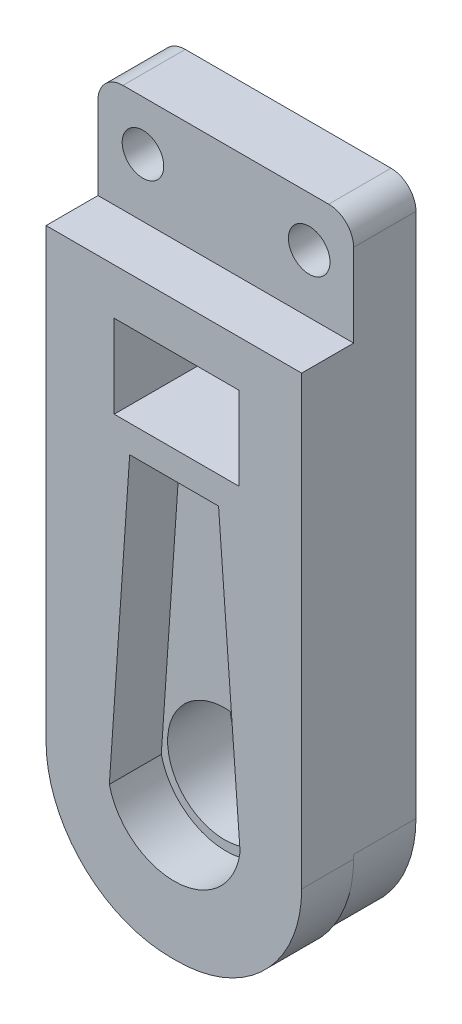
ISO-10303-21;
HEADER;
FILE_DESCRIPTION(('STEP AP214'),'2;1');
FILE_NAME('part.step','',(''),(''),'','','');
FILE_SCHEMA(('AUTOMOTIVE_DESIGN { 1 0 10303 214 1 1 1 1 }'));
ENDSEC;
DATA;
#1=APPLICATION_CONTEXT('core data for automotive mechanical design processes');
#2=APPLICATION_PROTOCOL_DEFINITION('international standard','automotive_design',2000,#1);
#3=PRODUCT_CONTEXT('',#1,'mechanical');
#4=PRODUCT('Part','Part','',(#3));
#5=PRODUCT_RELATED_PRODUCT_CATEGORY('part','',(#4));
#6=PRODUCT_DEFINITION_FORMATION('','',#4);
#7=PRODUCT_DEFINITION_CONTEXT('part definition',#1,'design');
#8=PRODUCT_DEFINITION('design','',#6,#7);
#9=PRODUCT_DEFINITION_SHAPE('','',#8);
#10=(LENGTH_UNIT() NAMED_UNIT(*) SI_UNIT(.MILLI.,.METRE.));
#11=(NAMED_UNIT(*) PLANE_ANGLE_UNIT() SI_UNIT($,.RADIAN.));
#12=(NAMED_UNIT(*) SI_UNIT($,.STERADIAN.) SOLID_ANGLE_UNIT());
#13=UNCERTAINTY_MEASURE_WITH_UNIT(LENGTH_MEASURE(1.E-05),#10,'distance_accuracy_value','');
#14=(GEOMETRIC_REPRESENTATION_CONTEXT(3) GLOBAL_UNCERTAINTY_ASSIGNED_CONTEXT((#13)) GLOBAL_UNIT_ASSIGNED_CONTEXT((#10,
#11,#12)) REPRESENTATION_CONTEXT('',''));
#15=CARTESIAN_POINT('',(0.,0.,0.));
#16=DIRECTION('',(0.,0.,1.));
#17=DIRECTION('',(1.,0.,0.));
#18=AXIS2_PLACEMENT_3D('',#15,#16,#17);
#19=CARTESIAN_POINT('',(0.,0.,13.));
#20=DIRECTION('',(0.,0.,1.));
#21=DIRECTION('',(1.,0.,0.));
#22=AXIS2_PLACEMENT_3D('',#19,#20,#21);
#23=PLANE('',#22);
#24=DIRECTION('',(-1.,0.,0.));
#25=VECTOR('',#24,1.);
#26=CARTESIAN_POINT('',(-188.162491079749,121.02562941971,13.));
#27=LINE('',#26,#25);
#28=CARTESIAN_POINT('',(-175.862491079749,121.02562941971,13.));
#29=VERTEX_POINT('',#28);
#30=CARTESIAN_POINT('',(-188.162491079749,121.02562941971,13.));
#31=VERTEX_POINT('',#30);
#32=EDGE_CURVE('E263',#29,#31,#27,.T.);
#33=ORIENTED_EDGE('',*,*,#32,.F.);
#34=DIRECTION('',(0.,1.,0.));
#35=VECTOR('',#34,1.);
#36=CARTESIAN_POINT('',(-175.862491079749,126.215842892689,13.));
#37=LINE('',#36,#35);
#38=CARTESIAN_POINT('',(-175.862491079749,125.015842892689,13.));
#39=VERTEX_POINT('',#38);
#40=EDGE_CURVE('E304',#29,#39,#37,.T.);
#41=ORIENTED_EDGE('',*,*,#40,.T.);
#42=CARTESIAN_POINT('',(-177.062491079749,125.015842892689,13.));
#43=DIRECTION('',(0.,0.,1.));
#44=DIRECTION('',(1.,0.,0.));
#45=AXIS2_PLACEMENT_3D('',#42,#43,#44);
#46=CIRCLE('',#45,1.2);
#47=CARTESIAN_POINT('',(-177.062491079749,126.215842892689,13.));
#48=VERTEX_POINT('',#47);
#49=EDGE_CURVE('E333',#39,#48,#46,.T.);
#50=ORIENTED_EDGE('',*,*,#49,.T.);
#51=DIRECTION('',(-1.,0.,0.));
#52=VECTOR('',#51,1.);
#53=CARTESIAN_POINT('',(-188.162491079749,126.215842892689,13.));
#54=LINE('',#53,#52);
#55=CARTESIAN_POINT('',(-186.962491079749,126.215842892689,13.));
#56=VERTEX_POINT('',#55);
#57=EDGE_CURVE('E306',#48,#56,#54,.T.);
#58=ORIENTED_EDGE('',*,*,#57,.T.);
#59=CARTESIAN_POINT('',(-186.962491079749,125.015842892689,13.));
#60=DIRECTION('',(0.,0.,1.));
#61=DIRECTION('',(1.,0.,0.));
#62=AXIS2_PLACEMENT_3D('',#59,#60,#61);
#63=CIRCLE('',#62,1.2);
#64=CARTESIAN_POINT('',(-188.162491079749,125.015842892689,13.));
#65=VERTEX_POINT('',#64);
#66=EDGE_CURVE('E331',#56,#65,#63,.T.);
#67=ORIENTED_EDGE('',*,*,#66,.T.);
#68=DIRECTION('',(0.,-1.,0.));
#69=VECTOR('',#68,1.);
#70=CARTESIAN_POINT('',(-188.162491079749,126.215842892689,13.));
#71=LINE('',#70,#69);
#72=EDGE_CURVE('E298',#65,#31,#71,.T.);
#73=ORIENTED_EDGE('',*,*,#72,.T.);
#74=EDGE_LOOP('',(#33,#41,#50,#58,#67,#73));
#75=FACE_BOUND('',#74,.T.);
#76=CARTESIAN_POINT('',(-185.999386631408,123.827694147511,13.));
#77=DIRECTION('',(0.,0.,1.));
#78=DIRECTION('',(1.,0.,0.));
#79=AXIS2_PLACEMENT_3D('',#76,#77,#78);
#80=CIRCLE('',#79,0.999999999999998);
#81=CARTESIAN_POINT('',(-184.999386631408,123.827694147511,13.));
#82=VERTEX_POINT('',#81);
#83=EDGE_CURVE('E292',#82,#82,#80,.T.);
#84=ORIENTED_EDGE('',*,*,#83,.F.);
#85=EDGE_LOOP('',(#84));
#86=FACE_BOUND('',#85,.T.);
#87=CARTESIAN_POINT('',(-177.999386631408,123.827694147511,13.));
#88=DIRECTION('',(0.,0.,1.));
#89=DIRECTION('',(1.,0.,0.));
#90=AXIS2_PLACEMENT_3D('',#87,#88,#89);
#91=CIRCLE('',#90,0.999999999999998);
#92=CARTESIAN_POINT('',(-176.999386631408,123.827694147511,13.));
#93=VERTEX_POINT('',#92);
#94=EDGE_CURVE('E286',#93,#93,#91,.T.);
#95=ORIENTED_EDGE('',*,*,#94,.F.);
#96=EDGE_LOOP('',(#95));
#97=FACE_BOUND('',#96,.T.);
#98=ADVANCED_FACE('F37',(#75,#86,#97),#23,.T.);
#99=CARTESIAN_POINT('',(0.,0.,10.));
#100=DIRECTION('',(0.,0.,1.));
#101=DIRECTION('',(1.,0.,0.));
#102=AXIS2_PLACEMENT_3D('',#99,#100,#101);
#103=PLANE('',#102);
#104=CARTESIAN_POINT('',(-182.062491079749,99.9726598983083,10.));
#105=DIRECTION('',(0.,0.,1.));
#106=DIRECTION('',(1.,0.,0.));
#107=AXIS2_PLACEMENT_3D('',#104,#105,#106);
#108=CIRCLE('',#107,2.75000000000001);
#109=CARTESIAN_POINT('',(-179.312491079749,99.9726598983083,10.));
#110=VERTEX_POINT('',#109);
#111=EDGE_CURVE('E219',#110,#110,#108,.T.);
#112=ORIENTED_EDGE('',*,*,#111,.T.);
#113=EDGE_LOOP('',(#112));
#114=FACE_BOUND('',#113,.T.);
#115=DIRECTION('',(-1.,0.,0.));
#116=VECTOR('',#115,1.);
#117=CARTESIAN_POINT('',(-184.883489059912,118.80293228032,10.));
#118=LINE('',#117,#116);
#119=CARTESIAN_POINT('',(-178.883489059912,118.80293228032,10.));
#120=VERTEX_POINT('',#119);
#121=CARTESIAN_POINT('',(-184.883489059912,118.80293228032,10.));
#122=VERTEX_POINT('',#121);
#123=EDGE_CURVE('E237',#120,#122,#118,.T.);
#124=ORIENTED_EDGE('',*,*,#123,.T.);
#125=DIRECTION('',(0.,-1.,0.));
#126=VECTOR('',#125,1.);
#127=CARTESIAN_POINT('',(-184.883489059912,118.80293228032,10.));
#128=LINE('',#127,#126);
#129=CARTESIAN_POINT('',(-184.883489059912,114.80293228032,10.));
#130=VERTEX_POINT('',#129);
#131=EDGE_CURVE('E229',#122,#130,#128,.T.);
#132=ORIENTED_EDGE('',*,*,#131,.T.);
#133=DIRECTION('',(1.,0.,0.));
#134=VECTOR('',#133,1.);
#135=CARTESIAN_POINT('',(-184.883489059912,114.80293228032,10.));
#136=LINE('',#135,#134);
#137=CARTESIAN_POINT('',(-178.883489059912,114.80293228032,10.));
#138=VERTEX_POINT('',#137);
#139=EDGE_CURVE('E232',#130,#138,#136,.T.);
#140=ORIENTED_EDGE('',*,*,#139,.T.);
#141=DIRECTION('',(0.,1.,0.));
#142=VECTOR('',#141,1.);
#143=CARTESIAN_POINT('',(-178.883489059912,118.80293228032,10.));
#144=LINE('',#143,#142);
#145=EDGE_CURVE('E60',#138,#120,#144,.T.);
#146=ORIENTED_EDGE('',*,*,#145,.T.);
#147=EDGE_LOOP('',(#124,#132,#140,#146));
#148=FACE_BOUND('',#147,.T.);
#149=DIRECTION('',(1.,0.,0.));
#150=VECTOR('',#149,1.);
#151=CARTESIAN_POINT('',(-188.162491079749,93.7158428926887,10.));
#152=LINE('',#151,#150);
#153=CARTESIAN_POINT('',(-182.162491079749,93.7158428926887,10.));
#154=VERTEX_POINT('',#153);
#155=CARTESIAN_POINT('',(-181.862491079749,93.7158428926887,10.));
#156=VERTEX_POINT('',#155);
#157=EDGE_CURVE('E312',#154,#156,#152,.T.);
#158=ORIENTED_EDGE('',*,*,#157,.F.);
#159=CARTESIAN_POINT('',(-182.162491079749,99.7158428926887,10.));
#160=DIRECTION('',(0.,0.,1.));
#161=DIRECTION('',(1.,0.,0.));
#162=AXIS2_PLACEMENT_3D('',#159,#160,#161);
#163=CIRCLE('',#162,6.);
#164=CARTESIAN_POINT('',(-188.162491079749,99.7158428926887,10.));
#165=VERTEX_POINT('',#164);
#166=EDGE_CURVE('E345',#154,#165,#163,.F.);
#167=ORIENTED_EDGE('',*,*,#166,.T.);
#168=DIRECTION('',(0.,-1.,0.));
#169=VECTOR('',#168,1.);
#170=CARTESIAN_POINT('',(-188.162491079749,126.215842892689,10.));
#171=LINE('',#170,#169);
#172=CARTESIAN_POINT('',(-188.162491079749,125.015842892689,10.));
#173=VERTEX_POINT('',#172);
#174=EDGE_CURVE('E295',#173,#165,#171,.T.);
#175=ORIENTED_EDGE('',*,*,#174,.F.);
#176=CARTESIAN_POINT('',(-186.962491079749,125.015842892689,10.));
#177=DIRECTION('',(0.,0.,1.));
#178=DIRECTION('',(1.,0.,0.));
#179=AXIS2_PLACEMENT_3D('',#176,#177,#178);
#180=CIRCLE('',#179,1.2);
#181=CARTESIAN_POINT('',(-186.962491079749,126.215842892689,10.));
#182=VERTEX_POINT('',#181);
#183=EDGE_CURVE('E323',#173,#182,#180,.F.);
#184=ORIENTED_EDGE('',*,*,#183,.T.);
#185=DIRECTION('',(-1.,0.,0.));
#186=VECTOR('',#185,1.);
#187=CARTESIAN_POINT('',(-188.162491079749,126.215842892689,10.));
#188=LINE('',#187,#186);
#189=CARTESIAN_POINT('',(-177.062491079749,126.215842892689,10.));
#190=VERTEX_POINT('',#189);
#191=EDGE_CURVE('E301',#190,#182,#188,.T.);
#192=ORIENTED_EDGE('',*,*,#191,.F.);
#193=CARTESIAN_POINT('',(-177.062491079749,125.015842892689,10.));
#194=DIRECTION('',(0.,0.,1.));
#195=DIRECTION('',(1.,0.,0.));
#196=AXIS2_PLACEMENT_3D('',#193,#194,#195);
#197=CIRCLE('',#196,1.2);
#198=CARTESIAN_POINT('',(-175.862491079749,125.015842892689,10.));
#199=VERTEX_POINT('',#198);
#200=EDGE_CURVE('E325',#190,#199,#197,.F.);
#201=ORIENTED_EDGE('',*,*,#200,.T.);
#202=DIRECTION('',(0.,1.,0.));
#203=VECTOR('',#202,1.);
#204=CARTESIAN_POINT('',(-175.862491079749,126.215842892689,10.));
#205=LINE('',#204,#203);
#206=CARTESIAN_POINT('',(-175.862491079749,99.7158428926887,10.));
#207=VERTEX_POINT('',#206);
#208=EDGE_CURVE('E315',#207,#199,#205,.T.);
#209=ORIENTED_EDGE('',*,*,#208,.F.);
#210=CARTESIAN_POINT('',(-181.862491079749,99.7158428926887,10.));
#211=DIRECTION('',(0.,0.,1.));
#212=DIRECTION('',(1.,0.,0.));
#213=AXIS2_PLACEMENT_3D('',#210,#211,#212);
#214=CIRCLE('',#213,6.);
#215=EDGE_CURVE('E343',#207,#156,#214,.F.);
#216=ORIENTED_EDGE('',*,*,#215,.T.);
#217=EDGE_LOOP('',(#158,#167,#175,#184,#192,#201,#209,#216));
#218=FACE_BOUND('',#217,.T.);
#219=CARTESIAN_POINT('',(-185.999386631408,123.827694147511,10.));
#220=DIRECTION('',(0.,0.,1.));
#221=DIRECTION('',(1.,0.,0.));
#222=AXIS2_PLACEMENT_3D('',#219,#220,#221);
#223=CIRCLE('',#222,0.999999999999998);
#224=CARTESIAN_POINT('',(-184.999386631408,123.827694147511,10.));
#225=VERTEX_POINT('',#224);
#226=EDGE_CURVE('E289',#225,#225,#223,.T.);
#227=ORIENTED_EDGE('',*,*,#226,.T.);
#228=EDGE_LOOP('',(#227));
#229=FACE_BOUND('',#228,.T.);
#230=CARTESIAN_POINT('',(-177.999386631408,123.827694147511,10.));
#231=DIRECTION('',(0.,0.,1.));
#232=DIRECTION('',(1.,0.,0.));
#233=AXIS2_PLACEMENT_3D('',#230,#231,#232);
#234=CIRCLE('',#233,0.999999999999998);
#235=CARTESIAN_POINT('',(-176.999386631408,123.827694147511,10.));
#236=VERTEX_POINT('',#235);
#237=EDGE_CURVE('E285',#236,#236,#234,.T.);
#238=ORIENTED_EDGE('',*,*,#237,.T.);
#239=EDGE_LOOP('',(#238));
#240=FACE_BOUND('',#239,.T.);
#241=ADVANCED_FACE('F409',(#114,#148,#218,#229,#240),#103,.F.);
#242=CARTESIAN_POINT('',(-188.162491079749,126.215842892689,13.));
#243=DIRECTION('',(1.,0.,0.));
#244=DIRECTION('',(0.,0.,-1.));
#245=AXIS2_PLACEMENT_3D('',#242,#243,#244);
#246=PLANE('',#245);
#247=DIRECTION('',(0.,-1.,0.));
#248=VECTOR('',#247,1.);
#249=CARTESIAN_POINT('',(-188.162491079749,121.02562941971,13.));
#250=LINE('',#249,#248);
#251=CARTESIAN_POINT('',(-188.162491079749,99.7158428926887,13.));
#252=VERTEX_POINT('',#251);
#253=CARTESIAN_POINT('',(-188.162491079749,99.5256294197101,13.));
#254=VERTEX_POINT('',#253);
#255=EDGE_CURVE('E252',#252,#254,#250,.T.);
#256=ORIENTED_EDGE('',*,*,#255,.T.);
#257=DIRECTION('',(0.,0.,-1.));
#258=VECTOR('',#257,1.);
#259=CARTESIAN_POINT('',(-188.162491079749,99.5256294197101,13.));
#260=LINE('',#259,#258);
#261=CARTESIAN_POINT('',(-188.162491079749,99.5256294197101,15.5));
#262=VERTEX_POINT('',#261);
#263=EDGE_CURVE('E367',#254,#262,#260,.F.);
#264=ORIENTED_EDGE('',*,*,#263,.T.);
#265=DIRECTION('',(0.,-1.,0.));
#266=VECTOR('',#265,1.);
#267=CARTESIAN_POINT('',(-188.162491079749,121.02562941971,15.5));
#268=LINE('',#267,#266);
#269=CARTESIAN_POINT('',(-188.162491079749,121.02562941971,15.5));
#270=VERTEX_POINT('',#269);
#271=EDGE_CURVE('E259',#270,#262,#268,.T.);
#272=ORIENTED_EDGE('',*,*,#271,.F.);
#273=DIRECTION('',(0.,0.,-1.));
#274=VECTOR('',#273,1.);
#275=CARTESIAN_POINT('',(-188.162491079749,121.02562941971,15.5));
#276=LINE('',#275,#274);
#277=EDGE_CURVE('E270',#270,#31,#276,.T.);
#278=ORIENTED_EDGE('',*,*,#277,.T.);
#279=ORIENTED_EDGE('',*,*,#72,.F.);
#280=DIRECTION('',(0.,0.,-1.));
#281=VECTOR('',#280,1.);
#282=CARTESIAN_POINT('',(-188.162491079749,125.015842892689,13.));
#283=LINE('',#282,#281);
#284=EDGE_CURVE('E335',#65,#173,#283,.T.);
#285=ORIENTED_EDGE('',*,*,#284,.T.);
#286=ORIENTED_EDGE('',*,*,#174,.T.);
#287=DIRECTION('',(0.,0.,-1.));
#288=VECTOR('',#287,1.);
#289=CARTESIAN_POINT('',(-188.162491079749,99.7158428926887,13.));
#290=LINE('',#289,#288);
#291=EDGE_CURVE('E347',#165,#252,#290,.F.);
#292=ORIENTED_EDGE('',*,*,#291,.T.);
#293=EDGE_LOOP('',(#256,#264,#272,#278,#279,#285,#286,#292));
#294=FACE_BOUND('',#293,.T.);
#295=ADVANCED_FACE('F388',(#294),#246,.F.);
#296=CARTESIAN_POINT('',(-188.162491079749,93.7158428926887,13.));
#297=DIRECTION('',(0.,1.,0.));
#298=DIRECTION('',(0.,0.,1.));
#299=AXIS2_PLACEMENT_3D('',#296,#297,#298);
#300=PLANE('',#299);
#301=DIRECTION('',(1.,0.,0.));
#302=VECTOR('',#301,1.);
#303=CARTESIAN_POINT('',(-188.162491079749,93.7158428926887,13.));
#304=LINE('',#303,#302);
#305=CARTESIAN_POINT('',(-182.162491079749,93.7158428926887,13.));
#306=VERTEX_POINT('',#305);
#307=CARTESIAN_POINT('',(-181.862491079749,93.7158428926887,13.));
#308=VERTEX_POINT('',#307);
#309=EDGE_CURVE('E300',#306,#308,#304,.T.);
#310=ORIENTED_EDGE('',*,*,#309,.F.);
#311=DIRECTION('',(0.,0.,-1.));
#312=VECTOR('',#311,1.);
#313=CARTESIAN_POINT('',(-182.162491079749,93.7158428926887,13.));
#314=LINE('',#313,#312);
#315=EDGE_CURVE('E340',#306,#154,#314,.T.);
#316=ORIENTED_EDGE('',*,*,#315,.T.);
#317=ORIENTED_EDGE('',*,*,#157,.T.);
#318=DIRECTION('',(0.,0.,-1.));
#319=VECTOR('',#318,1.);
#320=CARTESIAN_POINT('',(-181.862491079749,93.7158428926887,13.));
#321=LINE('',#320,#319);
#322=EDGE_CURVE('E338',#156,#308,#321,.F.);
#323=ORIENTED_EDGE('',*,*,#322,.T.);
#324=EDGE_LOOP('',(#310,#316,#317,#323));
#325=FACE_BOUND('',#324,.T.);
#326=ADVANCED_FACE('F398',(#325),#300,.F.);
#327=CARTESIAN_POINT('',(-175.862491079749,126.215842892689,13.));
#328=DIRECTION('',(-1.,0.,0.));
#329=DIRECTION('',(0.,0.,1.));
#330=AXIS2_PLACEMENT_3D('',#327,#328,#329);
#331=PLANE('',#330);
#332=DIRECTION('',(0.,1.,0.));
#333=VECTOR('',#332,1.);
#334=CARTESIAN_POINT('',(-175.862491079749,121.02562941971,15.5));
#335=LINE('',#334,#333);
#336=CARTESIAN_POINT('',(-175.862491079749,99.5256294197101,15.5));
#337=VERTEX_POINT('',#336);
#338=CARTESIAN_POINT('',(-175.862491079749,121.02562941971,15.5));
#339=VERTEX_POINT('',#338);
#340=EDGE_CURVE('E266',#337,#339,#335,.T.);
#341=ORIENTED_EDGE('',*,*,#340,.F.);
#342=DIRECTION('',(0.,0.,-1.));
#343=VECTOR('',#342,1.);
#344=CARTESIAN_POINT('',(-175.862491079749,99.5256294197101,13.));
#345=LINE('',#344,#343);
#346=CARTESIAN_POINT('',(-175.862491079749,99.5256294197101,13.));
#347=VERTEX_POINT('',#346);
#348=EDGE_CURVE('E11',#337,#347,#345,.T.);
#349=ORIENTED_EDGE('',*,*,#348,.T.);
#350=DIRECTION('',(0.,1.,0.));
#351=VECTOR('',#350,1.);
#352=CARTESIAN_POINT('',(-175.862491079749,121.02562941971,13.));
#353=LINE('',#352,#351);
#354=CARTESIAN_POINT('',(-175.862491079749,99.7158428926887,13.));
#355=VERTEX_POINT('',#354);
#356=EDGE_CURVE('E276',#347,#355,#353,.T.);
#357=ORIENTED_EDGE('',*,*,#356,.T.);
#358=DIRECTION('',(0.,0.,-1.));
#359=VECTOR('',#358,1.);
#360=CARTESIAN_POINT('',(-175.862491079749,99.7158428926887,13.));
#361=LINE('',#360,#359);
#362=EDGE_CURVE('E355',#355,#207,#361,.T.);
#363=ORIENTED_EDGE('',*,*,#362,.T.);
#364=ORIENTED_EDGE('',*,*,#208,.T.);
#365=DIRECTION('',(0.,0.,-1.));
#366=VECTOR('',#365,1.);
#367=CARTESIAN_POINT('',(-175.862491079749,125.015842892689,13.));
#368=LINE('',#367,#366);
#369=EDGE_CURVE('E328',#199,#39,#368,.F.);
#370=ORIENTED_EDGE('',*,*,#369,.T.);
#371=ORIENTED_EDGE('',*,*,#40,.F.);
#372=DIRECTION('',(0.,0.,-1.));
#373=VECTOR('',#372,1.);
#374=CARTESIAN_POINT('',(-175.862491079749,121.02562941971,15.5));
#375=LINE('',#374,#373);
#376=EDGE_CURVE('E282',#339,#29,#375,.T.);
#377=ORIENTED_EDGE('',*,*,#376,.F.);
#378=EDGE_LOOP('',(#341,#349,#357,#363,#364,#370,#371,#377));
#379=FACE_BOUND('',#378,.T.);
#380=ADVANCED_FACE('F407',(#379),#331,.F.);
#381=CARTESIAN_POINT('',(-188.162491079749,126.215842892689,13.));
#382=DIRECTION('',(0.,-1.,0.));
#383=DIRECTION('',(0.,0.,-1.));
#384=AXIS2_PLACEMENT_3D('',#381,#382,#383);
#385=PLANE('',#384);
#386=ORIENTED_EDGE('',*,*,#57,.F.);
#387=DIRECTION('',(0.,0.,-1.));
#388=VECTOR('',#387,1.);
#389=CARTESIAN_POINT('',(-177.062491079749,126.215842892689,13.));
#390=LINE('',#389,#388);
#391=EDGE_CURVE('E320',#48,#190,#390,.T.);
#392=ORIENTED_EDGE('',*,*,#391,.T.);
#393=ORIENTED_EDGE('',*,*,#191,.T.);
#394=DIRECTION('',(0.,0.,-1.));
#395=VECTOR('',#394,1.);
#396=CARTESIAN_POINT('',(-186.962491079749,126.215842892689,13.));
#397=LINE('',#396,#395);
#398=EDGE_CURVE('E309',#182,#56,#397,.F.);
#399=ORIENTED_EDGE('',*,*,#398,.T.);
#400=EDGE_LOOP('',(#386,#392,#393,#399));
#401=FACE_BOUND('',#400,.T.);
#402=ADVANCED_FACE('F447',(#401),#385,.F.);
#403=CARTESIAN_POINT('',(-185.999386631408,123.827694147511,13.));
#404=DIRECTION('',(0.,0.,-1.));
#405=DIRECTION('',(-1.,0.,0.));
#406=AXIS2_PLACEMENT_3D('',#403,#404,#405);
#407=CYLINDRICAL_SURFACE('',#406,0.999999999999998);
#408=ORIENTED_EDGE('',*,*,#83,.T.);
#409=EDGE_LOOP('',(#408));
#410=FACE_BOUND('',#409,.T.);
#411=ORIENTED_EDGE('',*,*,#226,.F.);
#412=EDGE_LOOP('',(#411));
#413=FACE_BOUND('',#412,.T.);
#414=ADVANCED_FACE('F444',(#410,#413),#407,.F.);
#415=CARTESIAN_POINT('',(-177.999386631408,123.827694147511,13.));
#416=DIRECTION('',(0.,0.,-1.));
#417=DIRECTION('',(-1.,0.,0.));
#418=AXIS2_PLACEMENT_3D('',#415,#416,#417);
#419=CYLINDRICAL_SURFACE('',#418,0.999999999999998);
#420=ORIENTED_EDGE('',*,*,#94,.T.);
#421=EDGE_LOOP('',(#420));
#422=FACE_BOUND('',#421,.T.);
#423=ORIENTED_EDGE('',*,*,#237,.F.);
#424=EDGE_LOOP('',(#423));
#425=FACE_BOUND('',#424,.T.);
#426=ADVANCED_FACE('F460',(#422,#425),#419,.F.);
#427=CARTESIAN_POINT('',(-177.062491079749,125.015842892689,13.));
#428=DIRECTION('',(0.,0.,-1.));
#429=DIRECTION('',(-1.,0.,0.));
#430=AXIS2_PLACEMENT_3D('',#427,#428,#429);
#431=CYLINDRICAL_SURFACE('',#430,1.2);
#432=ORIENTED_EDGE('',*,*,#49,.F.);
#433=ORIENTED_EDGE('',*,*,#369,.F.);
#434=ORIENTED_EDGE('',*,*,#200,.F.);
#435=ORIENTED_EDGE('',*,*,#391,.F.);
#436=EDGE_LOOP('',(#432,#433,#434,#435));
#437=FACE_BOUND('',#436,.T.);
#438=ADVANCED_FACE('F416',(#437),#431,.T.);
#439=CARTESIAN_POINT('',(-186.962491079749,125.015842892689,13.));
#440=DIRECTION('',(0.,0.,-1.));
#441=DIRECTION('',(-1.,0.,0.));
#442=AXIS2_PLACEMENT_3D('',#439,#440,#441);
#443=CYLINDRICAL_SURFACE('',#442,1.2);
#444=ORIENTED_EDGE('',*,*,#66,.F.);
#445=ORIENTED_EDGE('',*,*,#398,.F.);
#446=ORIENTED_EDGE('',*,*,#183,.F.);
#447=ORIENTED_EDGE('',*,*,#284,.F.);
#448=EDGE_LOOP('',(#444,#445,#446,#447));
#449=FACE_BOUND('',#448,.T.);
#450=ADVANCED_FACE('F459',(#449),#443,.T.);
#451=CARTESIAN_POINT('',(-182.162491079749,99.7158428926887,13.));
#452=DIRECTION('',(0.,0.,-1.));
#453=DIRECTION('',(-1.,0.,0.));
#454=AXIS2_PLACEMENT_3D('',#451,#452,#453);
#455=CYLINDRICAL_SURFACE('',#454,6.);
#456=CARTESIAN_POINT('',(-182.162491079749,99.7158428926887,13.));
#457=DIRECTION('',(0.,0.,1.));
#458=DIRECTION('',(1.,0.,0.));
#459=AXIS2_PLACEMENT_3D('',#456,#457,#458);
#460=CIRCLE('',#459,6.);
#461=EDGE_CURVE('E352',#252,#306,#460,.T.);
#462=ORIENTED_EDGE('',*,*,#461,.F.);
#463=ORIENTED_EDGE('',*,*,#291,.F.);
#464=ORIENTED_EDGE('',*,*,#166,.F.);
#465=ORIENTED_EDGE('',*,*,#315,.F.);
#466=EDGE_LOOP('',(#462,#463,#464,#465));
#467=FACE_BOUND('',#466,.T.);
#468=ADVANCED_FACE('F394',(#467),#455,.T.);
#469=CARTESIAN_POINT('',(-181.862491079749,99.7158428926887,13.));
#470=DIRECTION('',(0.,0.,-1.));
#471=DIRECTION('',(-1.,0.,0.));
#472=AXIS2_PLACEMENT_3D('',#469,#470,#471);
#473=CYLINDRICAL_SURFACE('',#472,6.);
#474=CARTESIAN_POINT('',(-181.862491079749,99.7158428926887,13.));
#475=DIRECTION('',(0.,0.,1.));
#476=DIRECTION('',(1.,0.,0.));
#477=AXIS2_PLACEMENT_3D('',#474,#475,#476);
#478=CIRCLE('',#477,6.);
#479=EDGE_CURVE('E349',#308,#355,#478,.T.);
#480=ORIENTED_EDGE('',*,*,#479,.F.);
#481=ORIENTED_EDGE('',*,*,#322,.F.);
#482=ORIENTED_EDGE('',*,*,#215,.F.);
#483=ORIENTED_EDGE('',*,*,#362,.F.);
#484=EDGE_LOOP('',(#480,#481,#482,#483));
#485=FACE_BOUND('',#484,.T.);
#486=ADVANCED_FACE('F403',(#485),#473,.T.);
#487=CARTESIAN_POINT('',(0.,0.,13.));
#488=DIRECTION('',(0.,0.,1.));
#489=DIRECTION('',(1.,0.,0.));
#490=AXIS2_PLACEMENT_3D('',#487,#488,#489);
#491=PLANE('',#490);
#492=DIRECTION('',(1.,0.,0.));
#493=VECTOR('',#492,1.);
#494=CARTESIAN_POINT('',(-188.162491079749,93.5256294197101,13.));
#495=LINE('',#494,#493);
#496=CARTESIAN_POINT('',(-182.162491079749,93.5256294197101,13.));
#497=VERTEX_POINT('',#496);
#498=CARTESIAN_POINT('',(-181.862491079749,93.5256294197101,13.));
#499=VERTEX_POINT('',#498);
#500=EDGE_CURVE('E273',#497,#499,#495,.T.);
#501=ORIENTED_EDGE('',*,*,#500,.F.);
#502=CARTESIAN_POINT('',(-182.162491079749,99.5256294197101,13.));
#503=DIRECTION('',(0.,0.,1.));
#504=DIRECTION('',(1.,0.,0.));
#505=AXIS2_PLACEMENT_3D('',#502,#503,#504);
#506=CIRCLE('',#505,6.);
#507=EDGE_CURVE('E365',#497,#254,#506,.F.);
#508=ORIENTED_EDGE('',*,*,#507,.T.);
#509=ORIENTED_EDGE('',*,*,#255,.F.);
#510=ORIENTED_EDGE('',*,*,#461,.T.);
#511=ORIENTED_EDGE('',*,*,#309,.T.);
#512=ORIENTED_EDGE('',*,*,#479,.T.);
#513=ORIENTED_EDGE('',*,*,#356,.F.);
#514=CARTESIAN_POINT('',(-181.862491079749,99.5256294197101,13.));
#515=DIRECTION('',(0.,0.,1.));
#516=DIRECTION('',(1.,0.,0.));
#517=AXIS2_PLACEMENT_3D('',#514,#515,#516);
#518=CIRCLE('',#517,6.);
#519=EDGE_CURVE('E363',#347,#499,#518,.F.);
#520=ORIENTED_EDGE('',*,*,#519,.T.);
#521=EDGE_LOOP('',(#501,#508,#509,#510,#511,#512,#513,#520));
#522=FACE_BOUND('',#521,.T.);
#523=ADVANCED_FACE('F386',(#522),#491,.F.);
#524=CARTESIAN_POINT('',(-188.162491079749,93.5256294197101,15.5));
#525=DIRECTION('',(0.,1.,0.));
#526=DIRECTION('',(0.,0.,1.));
#527=AXIS2_PLACEMENT_3D('',#524,#525,#526);
#528=PLANE('',#527);
#529=DIRECTION('',(1.,0.,0.));
#530=VECTOR('',#529,1.);
#531=CARTESIAN_POINT('',(-188.162491079749,93.5256294197101,15.5));
#532=LINE('',#531,#530);
#533=CARTESIAN_POINT('',(-182.162491079749,93.5256294197101,15.5));
#534=VERTEX_POINT('',#533);
#535=CARTESIAN_POINT('',(-181.862491079749,93.5256294197101,15.5));
#536=VERTEX_POINT('',#535);
#537=EDGE_CURVE('E262',#534,#536,#532,.T.);
#538=ORIENTED_EDGE('',*,*,#537,.F.);
#539=DIRECTION('',(0.,0.,-1.));
#540=VECTOR('',#539,1.);
#541=CARTESIAN_POINT('',(-182.162491079749,93.5256294197101,15.5));
#542=LINE('',#541,#540);
#543=EDGE_CURVE('E360',#534,#497,#542,.T.);
#544=ORIENTED_EDGE('',*,*,#543,.T.);
#545=ORIENTED_EDGE('',*,*,#500,.T.);
#546=DIRECTION('',(0.,0.,-1.));
#547=VECTOR('',#546,1.);
#548=CARTESIAN_POINT('',(-181.862491079749,93.5256294197101,15.5));
#549=LINE('',#548,#547);
#550=EDGE_CURVE('E358',#499,#536,#549,.F.);
#551=ORIENTED_EDGE('',*,*,#550,.T.);
#552=EDGE_LOOP('',(#538,#544,#545,#551));
#553=FACE_BOUND('',#552,.T.);
#554=ADVANCED_FACE('F380',(#553),#528,.F.);
#555=CARTESIAN_POINT('',(-188.162491079749,121.02562941971,15.5));
#556=DIRECTION('',(0.,-1.,0.));
#557=DIRECTION('',(0.,0.,-1.));
#558=AXIS2_PLACEMENT_3D('',#555,#556,#557);
#559=PLANE('',#558);
#560=ORIENTED_EDGE('',*,*,#32,.T.);
#561=ORIENTED_EDGE('',*,*,#277,.F.);
#562=DIRECTION('',(-1.,0.,0.));
#563=VECTOR('',#562,1.);
#564=CARTESIAN_POINT('',(-188.162491079749,121.02562941971,15.5));
#565=LINE('',#564,#563);
#566=EDGE_CURVE('E268',#339,#270,#565,.T.);
#567=ORIENTED_EDGE('',*,*,#566,.F.);
#568=ORIENTED_EDGE('',*,*,#376,.T.);
#569=EDGE_LOOP('',(#560,#561,#567,#568));
#570=FACE_BOUND('',#569,.T.);
#571=ADVANCED_FACE('F422',(#570),#559,.F.);
#572=CARTESIAN_POINT('',(0.,0.,15.5));
#573=DIRECTION('',(0.,0.,1.));
#574=DIRECTION('',(1.,0.,0.));
#575=AXIS2_PLACEMENT_3D('',#572,#573,#574);
#576=PLANE('',#575);
#577=DIRECTION('',(-0.0685973936681512,-0.997644424422819,0.));
#578=VECTOR('',#577,1.);
#579=CARTESIAN_POINT('',(-184.138427734375,113.48600769043,15.5));
#580=LINE('',#579,#578);
#581=CARTESIAN_POINT('',(-184.138427734375,113.48600769043,15.5));
#582=VERTEX_POINT('',#581);
#583=CARTESIAN_POINT('',(-185.116622924805,99.259651184082,15.5));
#584=VERTEX_POINT('',#583);
#585=EDGE_CURVE('E52',#582,#584,#580,.T.);
#586=ORIENTED_EDGE('',*,*,#585,.F.);
#587=DIRECTION('',(-1.,0.,0.));
#588=VECTOR('',#587,1.);
#589=CARTESIAN_POINT('',(-184.138427734375,113.48600769043,15.5));
#590=LINE('',#589,#588);
#591=CARTESIAN_POINT('',(-179.861572265625,113.48600769043,15.5));
#592=VERTEX_POINT('',#591);
#593=EDGE_CURVE('E206',#592,#582,#590,.T.);
#594=ORIENTED_EDGE('',*,*,#593,.F.);
#595=DIRECTION('',(-0.074379950661475,0.997229974950411,0.));
#596=VECTOR('',#595,1.);
#597=CARTESIAN_POINT('',(-179.861572265625,113.48600769043,15.5));
#598=LINE('',#597,#596);
#599=CARTESIAN_POINT('',(-178.824890136719,99.5869598388672,15.5));
#600=VERTEX_POINT('',#599);
#601=EDGE_CURVE('E209',#600,#592,#598,.T.);
#602=ORIENTED_EDGE('',*,*,#601,.F.);
#603=CARTESIAN_POINT('',(-181.999995573519,99.9853567781309,15.5));
#604=DIRECTION('',(0.,0.,1.));
#605=DIRECTION('',(1.,0.,0.));
#606=AXIS2_PLACEMENT_3D('',#603,#604,#605);
#607=CIRCLE('',#606,3.20000229000144);
#608=EDGE_CURVE('E218',#584,#600,#607,.T.);
#609=ORIENTED_EDGE('',*,*,#608,.F.);
#610=EDGE_LOOP('',(#586,#594,#602,#609));
#611=FACE_BOUND('',#610,.T.);
#612=DIRECTION('',(0.,-1.,0.));
#613=VECTOR('',#612,1.);
#614=CARTESIAN_POINT('',(-184.883489059912,118.80293228032,15.5));
#615=LINE('',#614,#613);
#616=CARTESIAN_POINT('',(-184.883489059912,118.80293228032,15.5));
#617=VERTEX_POINT('',#616);
#618=CARTESIAN_POINT('',(-184.883489059912,114.80293228032,15.5));
#619=VERTEX_POINT('',#618);
#620=EDGE_CURVE('E225',#617,#619,#615,.T.);
#621=ORIENTED_EDGE('',*,*,#620,.F.);
#622=DIRECTION('',(-1.,0.,0.));
#623=VECTOR('',#622,1.);
#624=CARTESIAN_POINT('',(-184.883489059912,118.80293228032,15.5));
#625=LINE('',#624,#623);
#626=CARTESIAN_POINT('',(-178.883489059912,118.80293228032,15.5));
#627=VERTEX_POINT('',#626);
#628=EDGE_CURVE('E233',#627,#617,#625,.T.);
#629=ORIENTED_EDGE('',*,*,#628,.F.);
#630=DIRECTION('',(0.,1.,0.));
#631=VECTOR('',#630,1.);
#632=CARTESIAN_POINT('',(-178.883489059912,118.80293228032,15.5));
#633=LINE('',#632,#631);
#634=CARTESIAN_POINT('',(-178.883489059912,114.80293228032,15.5));
#635=VERTEX_POINT('',#634);
#636=EDGE_CURVE('E245',#635,#627,#633,.T.);
#637=ORIENTED_EDGE('',*,*,#636,.F.);
#638=DIRECTION('',(1.,0.,0.));
#639=VECTOR('',#638,1.);
#640=CARTESIAN_POINT('',(-184.883489059912,114.80293228032,15.5));
#641=LINE('',#640,#639);
#642=EDGE_CURVE('E242',#619,#635,#641,.T.);
#643=ORIENTED_EDGE('',*,*,#642,.F.);
#644=EDGE_LOOP('',(#621,#629,#637,#643));
#645=FACE_BOUND('',#644,.T.);
#646=ORIENTED_EDGE('',*,*,#271,.T.);
#647=CARTESIAN_POINT('',(-182.162491079749,99.5256294197101,15.5));
#648=DIRECTION('',(0.,0.,1.));
#649=DIRECTION('',(1.,0.,0.));
#650=AXIS2_PLACEMENT_3D('',#647,#648,#649);
#651=CIRCLE('',#650,6.);
#652=EDGE_CURVE('E45',#262,#534,#651,.T.);
#653=ORIENTED_EDGE('',*,*,#652,.T.);
#654=ORIENTED_EDGE('',*,*,#537,.T.);
#655=CARTESIAN_POINT('',(-181.862491079749,99.5256294197101,15.5));
#656=DIRECTION('',(0.,0.,1.));
#657=DIRECTION('',(1.,0.,0.));
#658=AXIS2_PLACEMENT_3D('',#655,#656,#657);
#659=CIRCLE('',#658,6.);
#660=EDGE_CURVE('E369',#536,#337,#659,.T.);
#661=ORIENTED_EDGE('',*,*,#660,.T.);
#662=ORIENTED_EDGE('',*,*,#340,.T.);
#663=ORIENTED_EDGE('',*,*,#566,.T.);
#664=EDGE_LOOP('',(#646,#653,#654,#661,#662,#663));
#665=FACE_BOUND('',#664,.T.);
#666=ADVANCED_FACE('F373',(#611,#645,#665),#576,.T.);
#667=CARTESIAN_POINT('',(-182.162491079749,99.5256294197101,15.5));
#668=DIRECTION('',(0.,0.,-1.));
#669=DIRECTION('',(-1.,0.,0.));
#670=AXIS2_PLACEMENT_3D('',#667,#668,#669);
#671=CYLINDRICAL_SURFACE('',#670,6.);
#672=ORIENTED_EDGE('',*,*,#652,.F.);
#673=ORIENTED_EDGE('',*,*,#263,.F.);
#674=ORIENTED_EDGE('',*,*,#507,.F.);
#675=ORIENTED_EDGE('',*,*,#543,.F.);
#676=EDGE_LOOP('',(#672,#673,#674,#675));
#677=FACE_BOUND('',#676,.T.);
#678=ADVANCED_FACE('F383',(#677),#671,.T.);
#679=CARTESIAN_POINT('',(-181.862491079749,99.5256294197101,13.));
#680=DIRECTION('',(0.,0.,-1.));
#681=DIRECTION('',(-1.,0.,0.));
#682=AXIS2_PLACEMENT_3D('',#679,#680,#681);
#683=CYLINDRICAL_SURFACE('',#682,6.);
#684=ORIENTED_EDGE('',*,*,#660,.F.);
#685=ORIENTED_EDGE('',*,*,#550,.F.);
#686=ORIENTED_EDGE('',*,*,#519,.F.);
#687=ORIENTED_EDGE('',*,*,#348,.F.);
#688=EDGE_LOOP('',(#684,#685,#686,#687));
#689=FACE_BOUND('',#688,.T.);
#690=ADVANCED_FACE('F39',(#689),#683,.T.);
#691=CARTESIAN_POINT('',(-184.883489059912,118.80293228032,10.));
#692=DIRECTION('',(-1.,0.,0.));
#693=DIRECTION('',(0.,0.,1.));
#694=AXIS2_PLACEMENT_3D('',#691,#692,#693);
#695=PLANE('',#694);
#696=ORIENTED_EDGE('',*,*,#620,.T.);
#697=DIRECTION('',(0.,0.,1.));
#698=VECTOR('',#697,1.);
#699=CARTESIAN_POINT('',(-184.883489059912,114.80293228032,10.));
#700=LINE('',#699,#698);
#701=EDGE_CURVE('E240',#130,#619,#700,.T.);
#702=ORIENTED_EDGE('',*,*,#701,.F.);
#703=ORIENTED_EDGE('',*,*,#131,.F.);
#704=DIRECTION('',(0.,0.,1.));
#705=VECTOR('',#704,1.);
#706=CARTESIAN_POINT('',(-184.883489059912,118.80293228032,10.));
#707=LINE('',#706,#705);
#708=EDGE_CURVE('E250',#122,#617,#707,.T.);
#709=ORIENTED_EDGE('',*,*,#708,.T.);
#710=EDGE_LOOP('',(#696,#702,#703,#709));
#711=FACE_BOUND('',#710,.T.);
#712=ADVANCED_FACE('F427',(#711),#695,.F.);
#713=CARTESIAN_POINT('',(-184.883489059912,118.80293228032,10.));
#714=DIRECTION('',(0.,1.,0.));
#715=DIRECTION('',(0.,0.,1.));
#716=AXIS2_PLACEMENT_3D('',#713,#714,#715);
#717=PLANE('',#716);
#718=ORIENTED_EDGE('',*,*,#628,.T.);
#719=ORIENTED_EDGE('',*,*,#708,.F.);
#720=ORIENTED_EDGE('',*,*,#123,.F.);
#721=DIRECTION('',(0.,0.,1.));
#722=VECTOR('',#721,1.);
#723=CARTESIAN_POINT('',(-178.883489059912,118.80293228032,10.));
#724=LINE('',#723,#722);
#725=EDGE_CURVE('E253',#120,#627,#724,.T.);
#726=ORIENTED_EDGE('',*,*,#725,.T.);
#727=EDGE_LOOP('',(#718,#719,#720,#726));
#728=FACE_BOUND('',#727,.T.);
#729=ADVANCED_FACE('F432',(#728),#717,.F.);
#730=CARTESIAN_POINT('',(-178.883489059912,118.80293228032,10.));
#731=DIRECTION('',(1.,0.,0.));
#732=DIRECTION('',(0.,0.,-1.));
#733=AXIS2_PLACEMENT_3D('',#730,#731,#732);
#734=PLANE('',#733);
#735=ORIENTED_EDGE('',*,*,#636,.T.);
#736=ORIENTED_EDGE('',*,*,#725,.F.);
#737=ORIENTED_EDGE('',*,*,#145,.F.);
#738=DIRECTION('',(0.,0.,1.));
#739=VECTOR('',#738,1.);
#740=CARTESIAN_POINT('',(-178.883489059912,114.80293228032,10.));
#741=LINE('',#740,#739);
#742=EDGE_CURVE('E255',#138,#635,#741,.T.);
#743=ORIENTED_EDGE('',*,*,#742,.T.);
#744=EDGE_LOOP('',(#735,#736,#737,#743));
#745=FACE_BOUND('',#744,.T.);
#746=ADVANCED_FACE('F564',(#745),#734,.F.);
#747=CARTESIAN_POINT('',(-184.883489059912,114.80293228032,10.));
#748=DIRECTION('',(0.,-1.,0.));
#749=DIRECTION('',(0.,0.,-1.));
#750=AXIS2_PLACEMENT_3D('',#747,#748,#749);
#751=PLANE('',#750);
#752=ORIENTED_EDGE('',*,*,#642,.T.);
#753=ORIENTED_EDGE('',*,*,#742,.F.);
#754=ORIENTED_EDGE('',*,*,#139,.F.);
#755=ORIENTED_EDGE('',*,*,#701,.T.);
#756=EDGE_LOOP('',(#752,#753,#754,#755));
#757=FACE_BOUND('',#756,.T.);
#758=ADVANCED_FACE('F561',(#757),#751,.F.);
#759=CARTESIAN_POINT('',(-184.138427734375,113.48600769043,13.));
#760=DIRECTION('',(-0.997644424422819,0.0685973936681512,0.));
#761=DIRECTION('',(-0.0685973936681512,-0.997644424422819,0.));
#762=AXIS2_PLACEMENT_3D('',#759,#760,#761);
#763=PLANE('',#762);
#764=ORIENTED_EDGE('',*,*,#585,.T.);
#765=DIRECTION('',(0.,0.,1.));
#766=VECTOR('',#765,1.);
#767=CARTESIAN_POINT('',(-185.116622924805,99.259651184082,13.));
#768=LINE('',#767,#766);
#769=CARTESIAN_POINT('',(-185.116622924805,99.259651184082,13.));
#770=VERTEX_POINT('',#769);
#771=EDGE_CURVE('E184',#770,#584,#768,.T.);
#772=ORIENTED_EDGE('',*,*,#771,.F.);
#773=DIRECTION('',(-0.0685973936681512,-0.997644424422819,0.));
#774=VECTOR('',#773,1.);
#775=CARTESIAN_POINT('',(-184.138427734375,113.48600769043,13.));
#776=LINE('',#775,#774);
#777=CARTESIAN_POINT('',(-184.138427734375,113.48600769043,13.));
#778=VERTEX_POINT('',#777);
#779=EDGE_CURVE('E188',#778,#770,#776,.T.);
#780=ORIENTED_EDGE('',*,*,#779,.F.);
#781=DIRECTION('',(0.,0.,1.));
#782=VECTOR('',#781,1.);
#783=CARTESIAN_POINT('',(-184.138427734375,113.48600769043,13.));
#784=LINE('',#783,#782);
#785=EDGE_CURVE('E223',#778,#582,#784,.T.);
#786=ORIENTED_EDGE('',*,*,#785,.T.);
#787=EDGE_LOOP('',(#764,#772,#780,#786));
#788=FACE_BOUND('',#787,.T.);
#789=ADVANCED_FACE('F186',(#788),#763,.F.);
#790=CARTESIAN_POINT('',(-184.138427734375,113.48600769043,13.));
#791=DIRECTION('',(0.,1.,0.));
#792=DIRECTION('',(0.,0.,1.));
#793=AXIS2_PLACEMENT_3D('',#790,#791,#792);
#794=PLANE('',#793);
#795=ORIENTED_EDGE('',*,*,#593,.T.);
#796=ORIENTED_EDGE('',*,*,#785,.F.);
#797=DIRECTION('',(-1.,0.,0.));
#798=VECTOR('',#797,1.);
#799=CARTESIAN_POINT('',(-184.138427734375,113.48600769043,13.));
#800=LINE('',#799,#798);
#801=CARTESIAN_POINT('',(-179.861572265625,113.48600769043,13.));
#802=VERTEX_POINT('',#801);
#803=EDGE_CURVE('E194',#802,#778,#800,.T.);
#804=ORIENTED_EDGE('',*,*,#803,.F.);
#805=DIRECTION('',(0.,0.,1.));
#806=VECTOR('',#805,1.);
#807=CARTESIAN_POINT('',(-179.861572265625,113.48600769043,13.));
#808=LINE('',#807,#806);
#809=EDGE_CURVE('E226',#802,#592,#808,.T.);
#810=ORIENTED_EDGE('',*,*,#809,.T.);
#811=EDGE_LOOP('',(#795,#796,#804,#810));
#812=FACE_BOUND('',#811,.T.);
#813=ADVANCED_FACE('F550',(#812),#794,.F.);
#814=CARTESIAN_POINT('',(-179.861572265625,113.48600769043,13.));
#815=DIRECTION('',(0.997229974950411,0.074379950661475,0.));
#816=DIRECTION('',(-0.074379950661475,0.997229974950411,0.));
#817=AXIS2_PLACEMENT_3D('',#814,#815,#816);
#818=PLANE('',#817);
#819=ORIENTED_EDGE('',*,*,#601,.T.);
#820=ORIENTED_EDGE('',*,*,#809,.F.);
#821=DIRECTION('',(-0.074379950661475,0.997229974950411,0.));
#822=VECTOR('',#821,1.);
#823=CARTESIAN_POINT('',(-179.861572265625,113.48600769043,13.));
#824=LINE('',#823,#822);
#825=CARTESIAN_POINT('',(-178.824890136719,99.5869598388672,13.));
#826=VERTEX_POINT('',#825);
#827=EDGE_CURVE('E202',#826,#802,#824,.T.);
#828=ORIENTED_EDGE('',*,*,#827,.F.);
#829=DIRECTION('',(0.,0.,1.));
#830=VECTOR('',#829,1.);
#831=CARTESIAN_POINT('',(-178.824890136719,99.5869598388672,13.));
#832=LINE('',#831,#830);
#833=EDGE_CURVE('E193',#826,#600,#832,.T.);
#834=ORIENTED_EDGE('',*,*,#833,.T.);
#835=EDGE_LOOP('',(#819,#820,#828,#834));
#836=FACE_BOUND('',#835,.T.);
#837=ADVANCED_FACE('F553',(#836),#818,.F.);
#838=CARTESIAN_POINT('',(-181.999995573519,99.9853567781309,13.));
#839=DIRECTION('',(0.,0.,1.));
#840=DIRECTION('',(1.,0.,0.));
#841=AXIS2_PLACEMENT_3D('',#838,#839,#840);
#842=CYLINDRICAL_SURFACE('',#841,3.20000229000144);
#843=ORIENTED_EDGE('',*,*,#608,.T.);
#844=ORIENTED_EDGE('',*,*,#833,.F.);
#845=CARTESIAN_POINT('',(-181.999995573519,99.9853567781309,13.));
#846=DIRECTION('',(0.,0.,1.));
#847=DIRECTION('',(1.,0.,0.));
#848=AXIS2_PLACEMENT_3D('',#845,#846,#847);
#849=CIRCLE('',#848,3.20000229000144);
#850=EDGE_CURVE('E197',#770,#826,#849,.T.);
#851=ORIENTED_EDGE('',*,*,#850,.F.);
#852=ORIENTED_EDGE('',*,*,#771,.T.);
#853=EDGE_LOOP('',(#843,#844,#851,#852));
#854=FACE_BOUND('',#853,.T.);
#855=ADVANCED_FACE('F198',(#854),#842,.F.);
#856=CARTESIAN_POINT('',(-181.999995573519,99.9853567781309,13.));
#857=DIRECTION('',(0.,0.,1.));
#858=DIRECTION('',(1.,0.,0.));
#859=AXIS2_PLACEMENT_3D('',#856,#857,#858);
#860=PLANE('',#859);
#861=CARTESIAN_POINT('',(-182.062491079749,99.9726598983083,13.));
#862=DIRECTION('',(0.,0.,1.));
#863=DIRECTION('',(1.,0.,0.));
#864=AXIS2_PLACEMENT_3D('',#861,#862,#863);
#865=CIRCLE('',#864,2.75000000000001);
#866=CARTESIAN_POINT('',(-179.312491079749,99.9726598983083,13.));
#867=VERTEX_POINT('',#866);
#868=EDGE_CURVE('E212',#867,#867,#865,.T.);
#869=ORIENTED_EDGE('',*,*,#868,.F.);
#870=EDGE_LOOP('',(#869));
#871=FACE_BOUND('',#870,.T.);
#872=ORIENTED_EDGE('',*,*,#779,.T.);
#873=ORIENTED_EDGE('',*,*,#850,.T.);
#874=ORIENTED_EDGE('',*,*,#827,.T.);
#875=ORIENTED_EDGE('',*,*,#803,.T.);
#876=EDGE_LOOP('',(#872,#873,#874,#875));
#877=FACE_BOUND('',#876,.T.);
#878=ADVANCED_FACE('F204',(#871,#877),#860,.T.);
#879=CARTESIAN_POINT('',(-182.062491079749,99.9726598983083,10.));
#880=DIRECTION('',(0.,0.,1.));
#881=DIRECTION('',(1.,0.,0.));
#882=AXIS2_PLACEMENT_3D('',#879,#880,#881);
#883=CYLINDRICAL_SURFACE('',#882,2.75000000000001);
#884=ORIENTED_EDGE('',*,*,#111,.F.);
#885=EDGE_LOOP('',(#884));
#886=FACE_BOUND('',#885,.T.);
#887=ORIENTED_EDGE('',*,*,#868,.T.);
#888=EDGE_LOOP('',(#887));
#889=FACE_BOUND('',#888,.T.);
#890=ADVANCED_FACE('F533',(#886,#889),#883,.F.);
#891=CLOSED_SHELL('',(#98,#241,#295,#326,#380,#402,#414,#426,#438,#450,#468,#486,#523,#554,#571,
#666,#678,#690,#712,#729,#746,#758,#789,#813,#837,#855,#878,#890));
#892=MANIFOLD_SOLID_BREP('B2',#891);
#893=ADVANCED_BREP_SHAPE_REPRESENTATION('',(#18,#892),#14);
#894=SHAPE_DEFINITION_REPRESENTATION(#9,#893);
ENDSEC;
END-ISO-10303-21;
